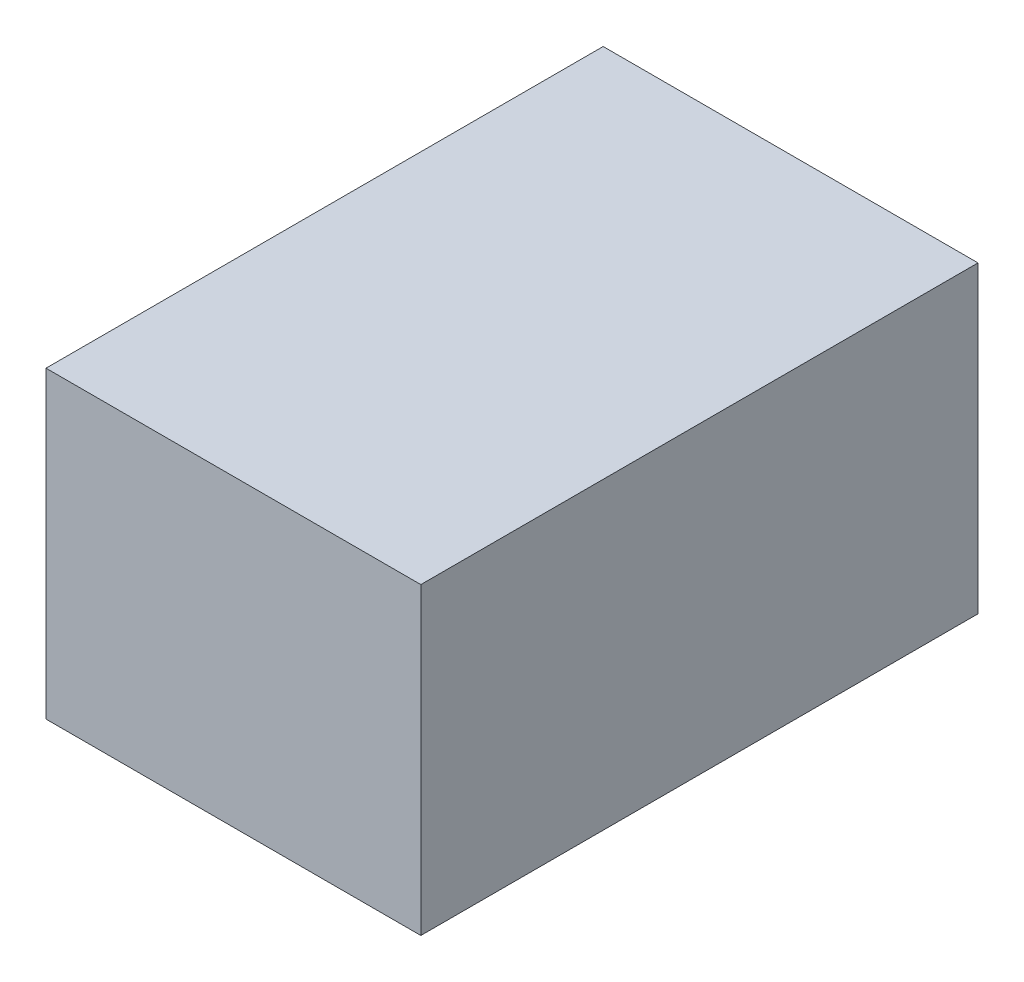
ISO-10303-21;
HEADER;
FILE_DESCRIPTION(('STEP AP214'),'2;1');
FILE_NAME('part.step','',(''),(''),'','','');
FILE_SCHEMA(('AUTOMOTIVE_DESIGN { 1 0 10303 214 1 1 1 1 }'));
ENDSEC;
DATA;
#1=APPLICATION_CONTEXT('core data for automotive mechanical design processes');
#2=APPLICATION_PROTOCOL_DEFINITION('international standard','automotive_design',2000,#1);
#3=PRODUCT_CONTEXT('',#1,'mechanical');
#4=PRODUCT('Part','Part','',(#3));
#5=PRODUCT_RELATED_PRODUCT_CATEGORY('part','',(#4));
#6=PRODUCT_DEFINITION_FORMATION('','',#4);
#7=PRODUCT_DEFINITION_CONTEXT('part definition',#1,'design');
#8=PRODUCT_DEFINITION('design','',#6,#7);
#9=PRODUCT_DEFINITION_SHAPE('','',#8);
#10=(LENGTH_UNIT() NAMED_UNIT(*) SI_UNIT(.MILLI.,.METRE.));
#11=(NAMED_UNIT(*) PLANE_ANGLE_UNIT() SI_UNIT($,.RADIAN.));
#12=(NAMED_UNIT(*) SI_UNIT($,.STERADIAN.) SOLID_ANGLE_UNIT());
#13=UNCERTAINTY_MEASURE_WITH_UNIT(LENGTH_MEASURE(1.E-05),#10,'distance_accuracy_value','');
#14=(GEOMETRIC_REPRESENTATION_CONTEXT(3) GLOBAL_UNCERTAINTY_ASSIGNED_CONTEXT((#13)) GLOBAL_UNIT_ASSIGNED_CONTEXT((#10,
#11,#12)) REPRESENTATION_CONTEXT('',''));
#15=CARTESIAN_POINT('',(0.,0.,0.));
#16=DIRECTION('',(0.,0.,1.));
#17=DIRECTION('',(1.,0.,0.));
#18=AXIS2_PLACEMENT_3D('',#15,#16,#17);
#19=CARTESIAN_POINT('',(0.,30.,0.));
#20=DIRECTION('',(-1.,0.,0.));
#21=DIRECTION('',(0.,0.,1.));
#22=AXIS2_PLACEMENT_3D('',#19,#20,#21);
#23=PLANE('',#22);
#24=DIRECTION('',(0.,0.,-1.));
#25=VECTOR('',#24,1.);
#26=CARTESIAN_POINT('',(0.,0.,0.));
#27=LINE('',#26,#25);
#28=CARTESIAN_POINT('',(0.,0.,0.));
#29=VERTEX_POINT('',#28);
#30=CARTESIAN_POINT('',(0.,0.,-55.));
#31=VERTEX_POINT('',#30);
#32=EDGE_CURVE('E118',#29,#31,#27,.T.);
#33=ORIENTED_EDGE('',*,*,#32,.F.);
#34=DIRECTION('',(0.,-1.,0.));
#35=VECTOR('',#34,1.);
#36=CARTESIAN_POINT('',(0.,30.,0.));
#37=LINE('',#36,#35);
#38=CARTESIAN_POINT('',(0.,30.,0.));
#39=VERTEX_POINT('',#38);
#40=EDGE_CURVE('E11',#39,#29,#37,.T.);
#41=ORIENTED_EDGE('',*,*,#40,.F.);
#42=DIRECTION('',(0.,0.,-1.));
#43=VECTOR('',#42,1.);
#44=CARTESIAN_POINT('',(0.,30.,0.));
#45=LINE('',#44,#43);
#46=CARTESIAN_POINT('',(0.,30.,-55.));
#47=VERTEX_POINT('',#46);
#48=EDGE_CURVE('E111',#39,#47,#45,.T.);
#49=ORIENTED_EDGE('',*,*,#48,.T.);
#50=DIRECTION('',(0.,-1.,0.));
#51=VECTOR('',#50,1.);
#52=CARTESIAN_POINT('',(0.,30.,-55.));
#53=LINE('',#52,#51);
#54=EDGE_CURVE('E50',#47,#31,#53,.T.);
#55=ORIENTED_EDGE('',*,*,#54,.T.);
#56=EDGE_LOOP('',(#33,#41,#49,#55));
#57=FACE_BOUND('',#56,.T.);
#58=ADVANCED_FACE('F47',(#57),#23,.T.);
#59=CARTESIAN_POINT('',(0.,30.,0.));
#60=DIRECTION('',(0.,0.,-1.));
#61=DIRECTION('',(-1.,0.,0.));
#62=AXIS2_PLACEMENT_3D('',#59,#60,#61);
#63=PLANE('',#62);
#64=DIRECTION('',(1.,0.,0.));
#65=VECTOR('',#64,1.);
#66=CARTESIAN_POINT('',(0.,0.,0.));
#67=LINE('',#66,#65);
#68=CARTESIAN_POINT('',(37.,0.,0.));
#69=VERTEX_POINT('',#68);
#70=EDGE_CURVE('E81',#29,#69,#67,.T.);
#71=ORIENTED_EDGE('',*,*,#70,.T.);
#72=DIRECTION('',(0.,-1.,0.));
#73=VECTOR('',#72,1.);
#74=CARTESIAN_POINT('',(37.,30.,0.));
#75=LINE('',#74,#73);
#76=CARTESIAN_POINT('',(37.,30.,0.));
#77=VERTEX_POINT('',#76);
#78=EDGE_CURVE('E57',#77,#69,#75,.T.);
#79=ORIENTED_EDGE('',*,*,#78,.F.);
#80=DIRECTION('',(1.,0.,0.));
#81=VECTOR('',#80,1.);
#82=CARTESIAN_POINT('',(0.,30.,0.));
#83=LINE('',#82,#81);
#84=EDGE_CURVE('E98',#39,#77,#83,.T.);
#85=ORIENTED_EDGE('',*,*,#84,.F.);
#86=ORIENTED_EDGE('',*,*,#40,.T.);
#87=EDGE_LOOP('',(#71,#79,#85,#86));
#88=FACE_BOUND('',#87,.T.);
#89=ADVANCED_FACE('F134',(#88),#63,.F.);
#90=CARTESIAN_POINT('',(37.,30.,0.));
#91=DIRECTION('',(-1.,0.,0.));
#92=DIRECTION('',(0.,0.,1.));
#93=AXIS2_PLACEMENT_3D('',#90,#91,#92);
#94=PLANE('',#93);
#95=DIRECTION('',(0.,0.,-1.));
#96=VECTOR('',#95,1.);
#97=CARTESIAN_POINT('',(37.,0.,0.));
#98=LINE('',#97,#96);
#99=CARTESIAN_POINT('',(37.,0.,-55.));
#100=VERTEX_POINT('',#99);
#101=EDGE_CURVE('E106',#69,#100,#98,.T.);
#102=ORIENTED_EDGE('',*,*,#101,.T.);
#103=DIRECTION('',(0.,-1.,0.));
#104=VECTOR('',#103,1.);
#105=CARTESIAN_POINT('',(37.,30.,-55.));
#106=LINE('',#105,#104);
#107=CARTESIAN_POINT('',(37.,30.,-55.));
#108=VERTEX_POINT('',#107);
#109=EDGE_CURVE('E103',#108,#100,#106,.T.);
#110=ORIENTED_EDGE('',*,*,#109,.F.);
#111=DIRECTION('',(0.,0.,-1.));
#112=VECTOR('',#111,1.);
#113=CARTESIAN_POINT('',(37.,30.,0.));
#114=LINE('',#113,#112);
#115=EDGE_CURVE('E93',#77,#108,#114,.T.);
#116=ORIENTED_EDGE('',*,*,#115,.F.);
#117=ORIENTED_EDGE('',*,*,#78,.T.);
#118=EDGE_LOOP('',(#102,#110,#116,#117));
#119=FACE_BOUND('',#118,.T.);
#120=ADVANCED_FACE('F104',(#119),#94,.F.);
#121=CARTESIAN_POINT('',(0.,30.,-55.));
#122=DIRECTION('',(0.,0.,-1.));
#123=DIRECTION('',(-1.,0.,0.));
#124=AXIS2_PLACEMENT_3D('',#121,#122,#123);
#125=PLANE('',#124);
#126=DIRECTION('',(1.,0.,0.));
#127=VECTOR('',#126,1.);
#128=CARTESIAN_POINT('',(0.,0.,-55.));
#129=LINE('',#128,#127);
#130=EDGE_CURVE('E122',#31,#100,#129,.T.);
#131=ORIENTED_EDGE('',*,*,#130,.F.);
#132=ORIENTED_EDGE('',*,*,#54,.F.);
#133=DIRECTION('',(1.,0.,0.));
#134=VECTOR('',#133,1.);
#135=CARTESIAN_POINT('',(0.,30.,-55.));
#136=LINE('',#135,#134);
#137=EDGE_CURVE('E97',#47,#108,#136,.T.);
#138=ORIENTED_EDGE('',*,*,#137,.T.);
#139=ORIENTED_EDGE('',*,*,#109,.T.);
#140=EDGE_LOOP('',(#131,#132,#138,#139));
#141=FACE_BOUND('',#140,.T.);
#142=ADVANCED_FACE('F109',(#141),#125,.T.);
#143=CARTESIAN_POINT('',(0.,30.,0.));
#144=DIRECTION('',(0.,-1.,0.));
#145=DIRECTION('',(0.,0.,-1.));
#146=AXIS2_PLACEMENT_3D('',#143,#144,#145);
#147=PLANE('',#146);
#148=ORIENTED_EDGE('',*,*,#48,.F.);
#149=ORIENTED_EDGE('',*,*,#84,.T.);
#150=ORIENTED_EDGE('',*,*,#115,.T.);
#151=ORIENTED_EDGE('',*,*,#137,.F.);
#152=EDGE_LOOP('',(#148,#149,#150,#151));
#153=FACE_BOUND('',#152,.T.);
#154=ADVANCED_FACE('F96',(#153),#147,.F.);
#155=CARTESIAN_POINT('',(0.,0.,0.));
#156=DIRECTION('',(0.,-1.,0.));
#157=DIRECTION('',(0.,0.,-1.));
#158=AXIS2_PLACEMENT_3D('',#155,#156,#157);
#159=PLANE('',#158);
#160=ORIENTED_EDGE('',*,*,#32,.T.);
#161=ORIENTED_EDGE('',*,*,#130,.T.);
#162=ORIENTED_EDGE('',*,*,#101,.F.);
#163=ORIENTED_EDGE('',*,*,#70,.F.);
#164=EDGE_LOOP('',(#160,#161,#162,#163));
#165=FACE_BOUND('',#164,.T.);
#166=ADVANCED_FACE('F131',(#165),#159,.T.);
#167=CLOSED_SHELL('',(#58,#89,#120,#142,#154,#166));
#168=MANIFOLD_SOLID_BREP('B2',#167);
#169=ADVANCED_BREP_SHAPE_REPRESENTATION('',(#18,#168),#14);
#170=SHAPE_DEFINITION_REPRESENTATION(#9,#169);
ENDSEC;
END-ISO-10303-21;
